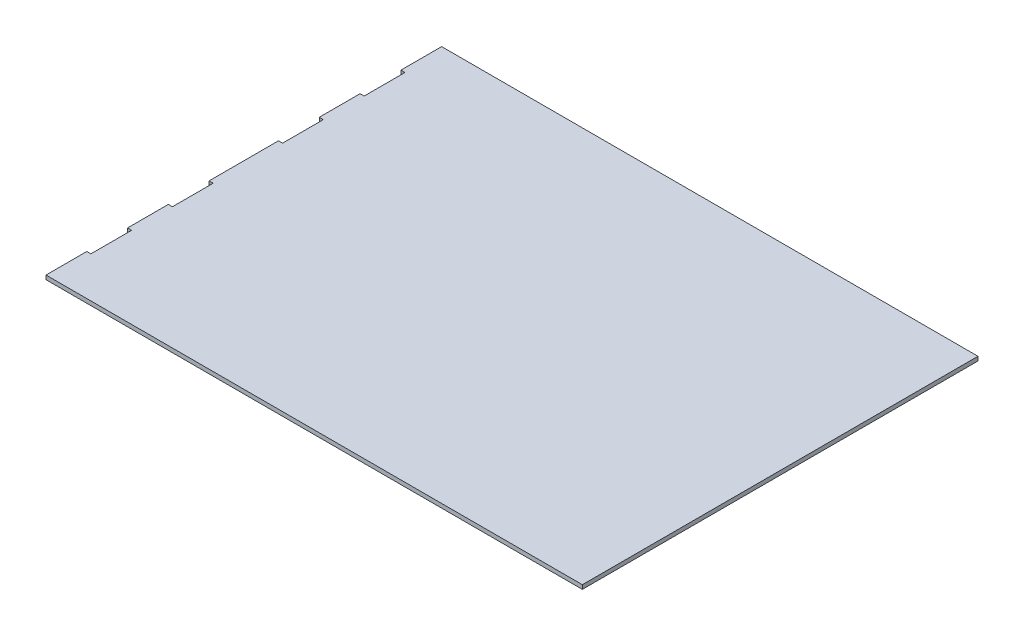
ISO-10303-21;
HEADER;
FILE_DESCRIPTION(('STEP AP214'),'2;1');
FILE_NAME('part.step','',(''),(''),'','','');
FILE_SCHEMA(('AUTOMOTIVE_DESIGN { 1 0 10303 214 1 1 1 1 }'));
ENDSEC;
DATA;
#1=APPLICATION_CONTEXT('core data for automotive mechanical design processes');
#2=APPLICATION_PROTOCOL_DEFINITION('international standard','automotive_design',2000,#1);
#3=PRODUCT_CONTEXT('',#1,'mechanical');
#4=PRODUCT('Part','Part','',(#3));
#5=PRODUCT_RELATED_PRODUCT_CATEGORY('part','',(#4));
#6=PRODUCT_DEFINITION_FORMATION('','',#4);
#7=PRODUCT_DEFINITION_CONTEXT('part definition',#1,'design');
#8=PRODUCT_DEFINITION('design','',#6,#7);
#9=PRODUCT_DEFINITION_SHAPE('','',#8);
#10=(LENGTH_UNIT() NAMED_UNIT(*) SI_UNIT(.MILLI.,.METRE.));
#11=(NAMED_UNIT(*) PLANE_ANGLE_UNIT() SI_UNIT($,.RADIAN.));
#12=(NAMED_UNIT(*) SI_UNIT($,.STERADIAN.) SOLID_ANGLE_UNIT());
#13=UNCERTAINTY_MEASURE_WITH_UNIT(LENGTH_MEASURE(1.E-05),#10,'distance_accuracy_value','');
#14=(GEOMETRIC_REPRESENTATION_CONTEXT(3) GLOBAL_UNCERTAINTY_ASSIGNED_CONTEXT((#13)) GLOBAL_UNIT_ASSIGNED_CONTEXT((#10,
#11,#12)) REPRESENTATION_CONTEXT('',''));
#15=CARTESIAN_POINT('',(0.,0.,0.));
#16=DIRECTION('',(0.,0.,1.));
#17=DIRECTION('',(1.,0.,0.));
#18=AXIS2_PLACEMENT_3D('',#15,#16,#17);
#19=CARTESIAN_POINT('',(-131.5,2.,-97.));
#20=DIRECTION('',(1.,0.,0.));
#21=DIRECTION('',(0.,0.,-1.));
#22=AXIS2_PLACEMENT_3D('',#19,#20,#21);
#23=PLANE('',#22);
#24=DIRECTION('',(0.,0.,1.));
#25=VECTOR('',#24,1.);
#26=CARTESIAN_POINT('',(-131.5,0.,-97.));
#27=LINE('',#26,#25);
#28=CARTESIAN_POINT('',(-131.5,0.,-97.));
#29=VERTEX_POINT('',#28);
#30=CARTESIAN_POINT('',(-131.5,0.,-77.));
#31=VERTEX_POINT('',#30);
#32=EDGE_CURVE('E213',#29,#31,#27,.T.);
#33=ORIENTED_EDGE('',*,*,#32,.T.);
#34=DIRECTION('',(0.,1.,0.));
#35=VECTOR('',#34,1.);
#36=CARTESIAN_POINT('',(-131.5,-8.,-77.));
#37=LINE('',#36,#35);
#38=CARTESIAN_POINT('',(-131.5,2.,-77.));
#39=VERTEX_POINT('',#38);
#40=EDGE_CURVE('E212',#31,#39,#37,.T.);
#41=ORIENTED_EDGE('',*,*,#40,.T.);
#42=DIRECTION('',(0.,0.,1.));
#43=VECTOR('',#42,1.);
#44=CARTESIAN_POINT('',(-131.5,2.,-97.));
#45=LINE('',#44,#43);
#46=CARTESIAN_POINT('',(-131.5,2.,-97.));
#47=VERTEX_POINT('',#46);
#48=EDGE_CURVE('E193',#47,#39,#45,.T.);
#49=ORIENTED_EDGE('',*,*,#48,.F.);
#50=DIRECTION('',(0.,-1.,0.));
#51=VECTOR('',#50,1.);
#52=CARTESIAN_POINT('',(-131.5,2.,-97.));
#53=LINE('',#52,#51);
#54=EDGE_CURVE('E231',#47,#29,#53,.T.);
#55=ORIENTED_EDGE('',*,*,#54,.T.);
#56=EDGE_LOOP('',(#33,#41,#49,#55));
#57=FACE_BOUND('',#56,.T.);
#58=ADVANCED_FACE('F33',(#57),#23,.F.);
#59=CARTESIAN_POINT('',(-131.5,2.,-57.));
#60=VERTEX_POINT('',#59);
#61=CARTESIAN_POINT('',(-131.5,2.,-37.));
#62=VERTEX_POINT('',#61);
#63=EDGE_CURVE('E186',#60,#62,#45,.T.);
#64=ORIENTED_EDGE('',*,*,#63,.F.);
#65=DIRECTION('',(0.,1.,0.));
#66=VECTOR('',#65,1.);
#67=CARTESIAN_POINT('',(-131.5,-8.,-57.));
#68=LINE('',#67,#66);
#69=CARTESIAN_POINT('',(-131.5,0.,-57.));
#70=VERTEX_POINT('',#69);
#71=EDGE_CURVE('E168',#70,#60,#68,.T.);
#72=ORIENTED_EDGE('',*,*,#71,.F.);
#73=CARTESIAN_POINT('',(-131.5,0.,-37.));
#74=VERTEX_POINT('',#73);
#75=EDGE_CURVE('E217',#70,#74,#27,.T.);
#76=ORIENTED_EDGE('',*,*,#75,.T.);
#77=DIRECTION('',(0.,1.,0.));
#78=VECTOR('',#77,1.);
#79=CARTESIAN_POINT('',(-131.5,-8.,-37.));
#80=LINE('',#79,#78);
#81=EDGE_CURVE('E189',#74,#62,#80,.T.);
#82=ORIENTED_EDGE('',*,*,#81,.T.);
#83=EDGE_LOOP('',(#64,#72,#76,#82));
#84=FACE_BOUND('',#83,.T.);
#85=ADVANCED_FACE('F192',(#84),#23,.F.);
#86=CARTESIAN_POINT('',(-131.5,2.,-17.));
#87=VERTEX_POINT('',#86);
#88=CARTESIAN_POINT('',(-131.5,2.,17.));
#89=VERTEX_POINT('',#88);
#90=EDGE_CURVE('E194',#87,#89,#45,.T.);
#91=ORIENTED_EDGE('',*,*,#90,.F.);
#92=DIRECTION('',(0.,1.,0.));
#93=VECTOR('',#92,1.);
#94=CARTESIAN_POINT('',(-131.5,-8.,-17.));
#95=LINE('',#94,#93);
#96=CARTESIAN_POINT('',(-131.5,0.,-17.));
#97=VERTEX_POINT('',#96);
#98=EDGE_CURVE('E284',#97,#87,#95,.T.);
#99=ORIENTED_EDGE('',*,*,#98,.F.);
#100=CARTESIAN_POINT('',(-131.5,0.,17.));
#101=VERTEX_POINT('',#100);
#102=EDGE_CURVE('E385',#97,#101,#27,.T.);
#103=ORIENTED_EDGE('',*,*,#102,.T.);
#104=DIRECTION('',(0.,1.,0.));
#105=VECTOR('',#104,1.);
#106=CARTESIAN_POINT('',(-131.5,-8.,17.));
#107=LINE('',#106,#105);
#108=EDGE_CURVE('E279',#101,#89,#107,.T.);
#109=ORIENTED_EDGE('',*,*,#108,.T.);
#110=EDGE_LOOP('',(#91,#99,#103,#109));
#111=FACE_BOUND('',#110,.T.);
#112=ADVANCED_FACE('F357',(#111),#23,.F.);
#113=CARTESIAN_POINT('',(-131.5,2.,37.));
#114=VERTEX_POINT('',#113);
#115=CARTESIAN_POINT('',(-131.5,2.,57.));
#116=VERTEX_POINT('',#115);
#117=EDGE_CURVE('E200',#114,#116,#45,.T.);
#118=ORIENTED_EDGE('',*,*,#117,.F.);
#119=DIRECTION('',(0.,1.,0.));
#120=VECTOR('',#119,1.);
#121=CARTESIAN_POINT('',(-131.5,-8.,37.));
#122=LINE('',#121,#120);
#123=CARTESIAN_POINT('',(-131.5,0.,37.));
#124=VERTEX_POINT('',#123);
#125=EDGE_CURVE('E299',#124,#114,#122,.T.);
#126=ORIENTED_EDGE('',*,*,#125,.F.);
#127=CARTESIAN_POINT('',(-131.5,0.,57.));
#128=VERTEX_POINT('',#127);
#129=EDGE_CURVE('E384',#124,#128,#27,.T.);
#130=ORIENTED_EDGE('',*,*,#129,.T.);
#131=DIRECTION('',(0.,1.,0.));
#132=VECTOR('',#131,1.);
#133=CARTESIAN_POINT('',(-131.5,-8.,57.));
#134=LINE('',#133,#132);
#135=EDGE_CURVE('E294',#128,#116,#134,.T.);
#136=ORIENTED_EDGE('',*,*,#135,.T.);
#137=EDGE_LOOP('',(#118,#126,#130,#136));
#138=FACE_BOUND('',#137,.T.);
#139=ADVANCED_FACE('F361',(#138),#23,.F.);
#140=CARTESIAN_POINT('',(-131.5,2.,-97.));
#141=DIRECTION('',(0.,0.,1.));
#142=DIRECTION('',(1.,0.,0.));
#143=AXIS2_PLACEMENT_3D('',#140,#141,#142);
#144=PLANE('',#143);
#145=DIRECTION('',(-1.,0.,0.));
#146=VECTOR('',#145,1.);
#147=CARTESIAN_POINT('',(-131.5,0.,-97.));
#148=LINE('',#147,#146);
#149=CARTESIAN_POINT('',(131.5,0.,-97.));
#150=VERTEX_POINT('',#149);
#151=EDGE_CURVE('E209',#150,#29,#148,.T.);
#152=ORIENTED_EDGE('',*,*,#151,.T.);
#153=ORIENTED_EDGE('',*,*,#54,.F.);
#154=DIRECTION('',(-1.,0.,0.));
#155=VECTOR('',#154,1.);
#156=CARTESIAN_POINT('',(113.5,2.,-97.));
#157=LINE('',#156,#155);
#158=CARTESIAN_POINT('',(131.5,2.,-97.));
#159=VERTEX_POINT('',#158);
#160=EDGE_CURVE('E203',#159,#47,#157,.T.);
#161=ORIENTED_EDGE('',*,*,#160,.F.);
#162=DIRECTION('',(0.,-1.,0.));
#163=VECTOR('',#162,1.);
#164=CARTESIAN_POINT('',(131.5,2.,-97.));
#165=LINE('',#164,#163);
#166=EDGE_CURVE('E208',#159,#150,#165,.T.);
#167=ORIENTED_EDGE('',*,*,#166,.T.);
#168=EDGE_LOOP('',(#152,#153,#161,#167));
#169=FACE_BOUND('',#168,.T.);
#170=ADVANCED_FACE('F35',(#169),#144,.F.);
#171=CARTESIAN_POINT('',(-131.5,2.,77.));
#172=VERTEX_POINT('',#171);
#173=CARTESIAN_POINT('',(-131.5,2.,97.));
#174=VERTEX_POINT('',#173);
#175=EDGE_CURVE('E198',#172,#174,#45,.T.);
#176=ORIENTED_EDGE('',*,*,#175,.F.);
#177=DIRECTION('',(0.,1.,0.));
#178=VECTOR('',#177,1.);
#179=CARTESIAN_POINT('',(-131.5,-8.,77.));
#180=LINE('',#179,#178);
#181=CARTESIAN_POINT('',(-131.5,0.,77.));
#182=VERTEX_POINT('',#181);
#183=EDGE_CURVE('E315',#182,#172,#180,.T.);
#184=ORIENTED_EDGE('',*,*,#183,.F.);
#185=CARTESIAN_POINT('',(-131.5,0.,97.));
#186=VERTEX_POINT('',#185);
#187=EDGE_CURVE('E211',#182,#186,#27,.T.);
#188=ORIENTED_EDGE('',*,*,#187,.T.);
#189=DIRECTION('',(0.,-1.,0.));
#190=VECTOR('',#189,1.);
#191=CARTESIAN_POINT('',(-131.5,2.,97.));
#192=LINE('',#191,#190);
#193=EDGE_CURVE('E228',#174,#186,#192,.T.);
#194=ORIENTED_EDGE('',*,*,#193,.F.);
#195=EDGE_LOOP('',(#176,#184,#188,#194));
#196=FACE_BOUND('',#195,.T.);
#197=ADVANCED_FACE('F331',(#196),#23,.F.);
#198=CARTESIAN_POINT('',(131.5,2.,97.));
#199=DIRECTION('',(0.,0.,-1.));
#200=DIRECTION('',(-1.,0.,0.));
#201=AXIS2_PLACEMENT_3D('',#198,#199,#200);
#202=PLANE('',#201);
#203=DIRECTION('',(1.,0.,0.));
#204=VECTOR('',#203,1.);
#205=CARTESIAN_POINT('',(131.5,0.,97.));
#206=LINE('',#205,#204);
#207=CARTESIAN_POINT('',(131.5,0.,97.));
#208=VERTEX_POINT('',#207);
#209=EDGE_CURVE('E216',#186,#208,#206,.T.);
#210=ORIENTED_EDGE('',*,*,#209,.T.);
#211=DIRECTION('',(0.,-1.,0.));
#212=VECTOR('',#211,1.);
#213=CARTESIAN_POINT('',(131.5,2.,97.));
#214=LINE('',#213,#212);
#215=CARTESIAN_POINT('',(131.5,2.,97.));
#216=VERTEX_POINT('',#215);
#217=EDGE_CURVE('E225',#216,#208,#214,.T.);
#218=ORIENTED_EDGE('',*,*,#217,.F.);
#219=DIRECTION('',(1.,0.,0.));
#220=VECTOR('',#219,1.);
#221=CARTESIAN_POINT('',(-113.5,2.,97.));
#222=LINE('',#221,#220);
#223=EDGE_CURVE('E197',#174,#216,#222,.T.);
#224=ORIENTED_EDGE('',*,*,#223,.F.);
#225=ORIENTED_EDGE('',*,*,#193,.T.);
#226=EDGE_LOOP('',(#210,#218,#224,#225));
#227=FACE_BOUND('',#226,.T.);
#228=ADVANCED_FACE('F360',(#227),#202,.F.);
#229=CARTESIAN_POINT('',(131.5,2.,-77.));
#230=DIRECTION('',(-1.,0.,0.));
#231=DIRECTION('',(0.,0.,1.));
#232=AXIS2_PLACEMENT_3D('',#229,#230,#231);
#233=PLANE('',#232);
#234=DIRECTION('',(0.,0.,-1.));
#235=VECTOR('',#234,1.);
#236=CARTESIAN_POINT('',(131.5,0.,-77.));
#237=LINE('',#236,#235);
#238=EDGE_CURVE('E220',#208,#150,#237,.T.);
#239=ORIENTED_EDGE('',*,*,#238,.T.);
#240=ORIENTED_EDGE('',*,*,#166,.F.);
#241=DIRECTION('',(0.,0.,-1.));
#242=VECTOR('',#241,1.);
#243=CARTESIAN_POINT('',(131.5,2.,97.));
#244=LINE('',#243,#242);
#245=EDGE_CURVE('E206',#216,#159,#244,.T.);
#246=ORIENTED_EDGE('',*,*,#245,.F.);
#247=ORIENTED_EDGE('',*,*,#217,.T.);
#248=EDGE_LOOP('',(#239,#240,#246,#247));
#249=FACE_BOUND('',#248,.T.);
#250=ADVANCED_FACE('F366',(#249),#233,.F.);
#251=CARTESIAN_POINT('',(0.,2.,0.));
#252=DIRECTION('',(0.,1.,0.));
#253=DIRECTION('',(0.,0.,1.));
#254=AXIS2_PLACEMENT_3D('',#251,#252,#253);
#255=PLANE('',#254);
#256=DIRECTION('',(-1.,0.,0.));
#257=VECTOR('',#256,1.);
#258=CARTESIAN_POINT('',(-131.5,2.,-77.));
#259=LINE('',#258,#257);
#260=CARTESIAN_POINT('',(-129.5,2.,-77.));
#261=VERTEX_POINT('',#260);
#262=EDGE_CURVE('E179',#261,#39,#259,.T.);
#263=ORIENTED_EDGE('',*,*,#262,.F.);
#264=DIRECTION('',(0.,0.,-1.));
#265=VECTOR('',#264,1.);
#266=CARTESIAN_POINT('',(-129.5,2.,-77.));
#267=LINE('',#266,#265);
#268=CARTESIAN_POINT('',(-129.5,2.,-57.));
#269=VERTEX_POINT('',#268);
#270=EDGE_CURVE('E188',#269,#261,#267,.T.);
#271=ORIENTED_EDGE('',*,*,#270,.F.);
#272=DIRECTION('',(1.,0.,0.));
#273=VECTOR('',#272,1.);
#274=CARTESIAN_POINT('',(-131.5,2.,-57.));
#275=LINE('',#274,#273);
#276=EDGE_CURVE('E171',#60,#269,#275,.T.);
#277=ORIENTED_EDGE('',*,*,#276,.F.);
#278=ORIENTED_EDGE('',*,*,#63,.T.);
#279=DIRECTION('',(-1.,0.,0.));
#280=VECTOR('',#279,1.);
#281=CARTESIAN_POINT('',(-131.5,2.,-37.));
#282=LINE('',#281,#280);
#283=CARTESIAN_POINT('',(-129.5,2.,-37.));
#284=VERTEX_POINT('',#283);
#285=EDGE_CURVE('E282',#284,#62,#282,.T.);
#286=ORIENTED_EDGE('',*,*,#285,.F.);
#287=DIRECTION('',(0.,0.,-1.));
#288=VECTOR('',#287,1.);
#289=CARTESIAN_POINT('',(-129.5,2.,-37.));
#290=LINE('',#289,#288);
#291=CARTESIAN_POINT('',(-129.5,2.,-17.));
#292=VERTEX_POINT('',#291);
#293=EDGE_CURVE('E278',#292,#284,#290,.T.);
#294=ORIENTED_EDGE('',*,*,#293,.F.);
#295=DIRECTION('',(1.,0.,0.));
#296=VECTOR('',#295,1.);
#297=CARTESIAN_POINT('',(-131.5,2.,-17.));
#298=LINE('',#297,#296);
#299=EDGE_CURVE('E276',#87,#292,#298,.T.);
#300=ORIENTED_EDGE('',*,*,#299,.F.);
#301=ORIENTED_EDGE('',*,*,#90,.T.);
#302=DIRECTION('',(-1.,0.,0.));
#303=VECTOR('',#302,1.);
#304=CARTESIAN_POINT('',(-131.5,2.,17.));
#305=LINE('',#304,#303);
#306=CARTESIAN_POINT('',(-129.5,2.,17.));
#307=VERTEX_POINT('',#306);
#308=EDGE_CURVE('E297',#307,#89,#305,.T.);
#309=ORIENTED_EDGE('',*,*,#308,.F.);
#310=DIRECTION('',(0.,0.,-1.));
#311=VECTOR('',#310,1.);
#312=CARTESIAN_POINT('',(-129.5,2.,37.));
#313=LINE('',#312,#311);
#314=CARTESIAN_POINT('',(-129.5,2.,37.));
#315=VERTEX_POINT('',#314);
#316=EDGE_CURVE('E293',#315,#307,#313,.T.);
#317=ORIENTED_EDGE('',*,*,#316,.F.);
#318=DIRECTION('',(1.,0.,0.));
#319=VECTOR('',#318,1.);
#320=CARTESIAN_POINT('',(-131.5,2.,37.));
#321=LINE('',#320,#319);
#322=EDGE_CURVE('E290',#114,#315,#321,.T.);
#323=ORIENTED_EDGE('',*,*,#322,.F.);
#324=ORIENTED_EDGE('',*,*,#117,.T.);
#325=DIRECTION('',(-1.,0.,0.));
#326=VECTOR('',#325,1.);
#327=CARTESIAN_POINT('',(-131.5,2.,57.));
#328=LINE('',#327,#326);
#329=CARTESIAN_POINT('',(-129.5,2.,57.));
#330=VERTEX_POINT('',#329);
#331=EDGE_CURVE('E313',#330,#116,#328,.T.);
#332=ORIENTED_EDGE('',*,*,#331,.F.);
#333=DIRECTION('',(0.,0.,-1.));
#334=VECTOR('',#333,1.);
#335=CARTESIAN_POINT('',(-129.5,2.,77.));
#336=LINE('',#335,#334);
#337=CARTESIAN_POINT('',(-129.5,2.,77.));
#338=VERTEX_POINT('',#337);
#339=EDGE_CURVE('E310',#338,#330,#336,.T.);
#340=ORIENTED_EDGE('',*,*,#339,.F.);
#341=DIRECTION('',(1.,0.,0.));
#342=VECTOR('',#341,1.);
#343=CARTESIAN_POINT('',(-131.5,2.,77.));
#344=LINE('',#343,#342);
#345=EDGE_CURVE('E307',#172,#338,#344,.T.);
#346=ORIENTED_EDGE('',*,*,#345,.F.);
#347=ORIENTED_EDGE('',*,*,#175,.T.);
#348=ORIENTED_EDGE('',*,*,#223,.T.);
#349=ORIENTED_EDGE('',*,*,#245,.T.);
#350=ORIENTED_EDGE('',*,*,#160,.T.);
#351=ORIENTED_EDGE('',*,*,#48,.T.);
#352=EDGE_LOOP('',(#263,#271,#277,#278,#286,#294,#300,#301,#309,#317,#323,#324,#332,#340,#346,
#347,#348,#349,#350,#351));
#353=FACE_BOUND('',#352,.T.);
#354=ADVANCED_FACE('F184',(#353),#255,.T.);
#355=CARTESIAN_POINT('',(0.,0.,0.));
#356=DIRECTION('',(0.,1.,0.));
#357=DIRECTION('',(0.,0.,1.));
#358=AXIS2_PLACEMENT_3D('',#355,#356,#357);
#359=PLANE('',#358);
#360=DIRECTION('',(0.,0.,-1.));
#361=VECTOR('',#360,1.);
#362=CARTESIAN_POINT('',(-129.5,0.,0.));
#363=LINE('',#362,#361);
#364=CARTESIAN_POINT('',(-129.5,0.,-57.));
#365=VERTEX_POINT('',#364);
#366=CARTESIAN_POINT('',(-129.5,0.,-77.));
#367=VERTEX_POINT('',#366);
#368=EDGE_CURVE('E41',#365,#367,#363,.T.);
#369=ORIENTED_EDGE('',*,*,#368,.T.);
#370=DIRECTION('',(-1.,0.,0.));
#371=VECTOR('',#370,1.);
#372=CARTESIAN_POINT('',(0.,0.,-77.));
#373=LINE('',#372,#371);
#374=EDGE_CURVE('E11',#367,#31,#373,.T.);
#375=ORIENTED_EDGE('',*,*,#374,.T.);
#376=ORIENTED_EDGE('',*,*,#32,.F.);
#377=ORIENTED_EDGE('',*,*,#151,.F.);
#378=ORIENTED_EDGE('',*,*,#238,.F.);
#379=ORIENTED_EDGE('',*,*,#209,.F.);
#380=ORIENTED_EDGE('',*,*,#187,.F.);
#381=DIRECTION('',(1.,0.,0.));
#382=VECTOR('',#381,1.);
#383=CARTESIAN_POINT('',(0.,0.,77.));
#384=LINE('',#383,#382);
#385=CARTESIAN_POINT('',(-129.5,0.,77.));
#386=VERTEX_POINT('',#385);
#387=EDGE_CURVE('E234',#182,#386,#384,.T.);
#388=ORIENTED_EDGE('',*,*,#387,.T.);
#389=DIRECTION('',(0.,0.,-1.));
#390=VECTOR('',#389,1.);
#391=CARTESIAN_POINT('',(-129.5,0.,0.));
#392=LINE('',#391,#390);
#393=CARTESIAN_POINT('',(-129.5,0.,57.));
#394=VERTEX_POINT('',#393);
#395=EDGE_CURVE('E237',#386,#394,#392,.T.);
#396=ORIENTED_EDGE('',*,*,#395,.T.);
#397=DIRECTION('',(-1.,0.,0.));
#398=VECTOR('',#397,1.);
#399=CARTESIAN_POINT('',(0.,0.,57.));
#400=LINE('',#399,#398);
#401=EDGE_CURVE('E240',#394,#128,#400,.T.);
#402=ORIENTED_EDGE('',*,*,#401,.T.);
#403=ORIENTED_EDGE('',*,*,#129,.F.);
#404=DIRECTION('',(1.,0.,0.));
#405=VECTOR('',#404,1.);
#406=CARTESIAN_POINT('',(0.,0.,37.));
#407=LINE('',#406,#405);
#408=CARTESIAN_POINT('',(-129.5,0.,37.));
#409=VERTEX_POINT('',#408);
#410=EDGE_CURVE('E243',#124,#409,#407,.T.);
#411=ORIENTED_EDGE('',*,*,#410,.T.);
#412=DIRECTION('',(0.,0.,-1.));
#413=VECTOR('',#412,1.);
#414=CARTESIAN_POINT('',(-129.5,0.,0.));
#415=LINE('',#414,#413);
#416=CARTESIAN_POINT('',(-129.5,0.,17.));
#417=VERTEX_POINT('',#416);
#418=EDGE_CURVE('E246',#409,#417,#415,.T.);
#419=ORIENTED_EDGE('',*,*,#418,.T.);
#420=DIRECTION('',(-1.,0.,0.));
#421=VECTOR('',#420,1.);
#422=CARTESIAN_POINT('',(0.,0.,17.));
#423=LINE('',#422,#421);
#424=EDGE_CURVE('E249',#417,#101,#423,.T.);
#425=ORIENTED_EDGE('',*,*,#424,.T.);
#426=ORIENTED_EDGE('',*,*,#102,.F.);
#427=DIRECTION('',(1.,0.,0.));
#428=VECTOR('',#427,1.);
#429=CARTESIAN_POINT('',(0.,0.,-17.));
#430=LINE('',#429,#428);
#431=CARTESIAN_POINT('',(-129.5,0.,-17.));
#432=VERTEX_POINT('',#431);
#433=EDGE_CURVE('E252',#97,#432,#430,.T.);
#434=ORIENTED_EDGE('',*,*,#433,.T.);
#435=DIRECTION('',(0.,0.,-1.));
#436=VECTOR('',#435,1.);
#437=CARTESIAN_POINT('',(-129.5,0.,0.));
#438=LINE('',#437,#436);
#439=CARTESIAN_POINT('',(-129.5,0.,-37.));
#440=VERTEX_POINT('',#439);
#441=EDGE_CURVE('E255',#432,#440,#438,.T.);
#442=ORIENTED_EDGE('',*,*,#441,.T.);
#443=DIRECTION('',(-1.,0.,0.));
#444=VECTOR('',#443,1.);
#445=CARTESIAN_POINT('',(0.,0.,-37.));
#446=LINE('',#445,#444);
#447=EDGE_CURVE('E258',#440,#74,#446,.T.);
#448=ORIENTED_EDGE('',*,*,#447,.T.);
#449=ORIENTED_EDGE('',*,*,#75,.F.);
#450=DIRECTION('',(1.,0.,0.));
#451=VECTOR('',#450,1.);
#452=CARTESIAN_POINT('',(0.,0.,-57.));
#453=LINE('',#452,#451);
#454=EDGE_CURVE('E174',#70,#365,#453,.T.);
#455=ORIENTED_EDGE('',*,*,#454,.T.);
#456=EDGE_LOOP('',(#369,#375,#376,#377,#378,#379,#380,#388,#396,#402,#403,#411,#419,#425,#426,
#434,#442,#448,#449,#455));
#457=FACE_BOUND('',#456,.T.);
#458=ADVANCED_FACE('F263',(#457),#359,.F.);
#459=CARTESIAN_POINT('',(-131.5,-8.,57.));
#460=DIRECTION('',(0.,0.,-1.));
#461=DIRECTION('',(-1.,0.,0.));
#462=AXIS2_PLACEMENT_3D('',#459,#460,#461);
#463=PLANE('',#462);
#464=DIRECTION('',(0.,1.,0.));
#465=VECTOR('',#464,1.);
#466=CARTESIAN_POINT('',(-129.5,-8.,57.));
#467=LINE('',#466,#465);
#468=EDGE_CURVE('E318',#394,#330,#467,.T.);
#469=ORIENTED_EDGE('',*,*,#468,.T.);
#470=ORIENTED_EDGE('',*,*,#331,.T.);
#471=ORIENTED_EDGE('',*,*,#135,.F.);
#472=ORIENTED_EDGE('',*,*,#401,.F.);
#473=EDGE_LOOP('',(#469,#470,#471,#472));
#474=FACE_BOUND('',#473,.T.);
#475=ADVANCED_FACE('F398',(#474),#463,.F.);
#476=CARTESIAN_POINT('',(-129.5,-8.,77.));
#477=DIRECTION('',(1.,0.,0.));
#478=DIRECTION('',(0.,0.,-1.));
#479=AXIS2_PLACEMENT_3D('',#476,#477,#478);
#480=PLANE('',#479);
#481=DIRECTION('',(0.,1.,0.));
#482=VECTOR('',#481,1.);
#483=CARTESIAN_POINT('',(-129.5,-8.,77.));
#484=LINE('',#483,#482);
#485=EDGE_CURVE('E320',#386,#338,#484,.T.);
#486=ORIENTED_EDGE('',*,*,#485,.T.);
#487=ORIENTED_EDGE('',*,*,#339,.T.);
#488=ORIENTED_EDGE('',*,*,#468,.F.);
#489=ORIENTED_EDGE('',*,*,#395,.F.);
#490=EDGE_LOOP('',(#486,#487,#488,#489));
#491=FACE_BOUND('',#490,.T.);
#492=ADVANCED_FACE('F403',(#491),#480,.F.);
#493=CARTESIAN_POINT('',(-131.5,-8.,77.));
#494=DIRECTION('',(0.,0.,1.));
#495=DIRECTION('',(1.,0.,0.));
#496=AXIS2_PLACEMENT_3D('',#493,#494,#495);
#497=PLANE('',#496);
#498=ORIENTED_EDGE('',*,*,#183,.T.);
#499=ORIENTED_EDGE('',*,*,#345,.T.);
#500=ORIENTED_EDGE('',*,*,#485,.F.);
#501=ORIENTED_EDGE('',*,*,#387,.F.);
#502=EDGE_LOOP('',(#498,#499,#500,#501));
#503=FACE_BOUND('',#502,.T.);
#504=ADVANCED_FACE('F324',(#503),#497,.F.);
#505=CARTESIAN_POINT('',(-131.5,-8.,17.));
#506=DIRECTION('',(0.,0.,-1.));
#507=DIRECTION('',(-1.,0.,0.));
#508=AXIS2_PLACEMENT_3D('',#505,#506,#507);
#509=PLANE('',#508);
#510=DIRECTION('',(0.,1.,0.));
#511=VECTOR('',#510,1.);
#512=CARTESIAN_POINT('',(-129.5,-8.,17.));
#513=LINE('',#512,#511);
#514=EDGE_CURVE('E302',#417,#307,#513,.T.);
#515=ORIENTED_EDGE('',*,*,#514,.T.);
#516=ORIENTED_EDGE('',*,*,#308,.T.);
#517=ORIENTED_EDGE('',*,*,#108,.F.);
#518=ORIENTED_EDGE('',*,*,#424,.F.);
#519=EDGE_LOOP('',(#515,#516,#517,#518));
#520=FACE_BOUND('',#519,.T.);
#521=ADVANCED_FACE('F402',(#520),#509,.F.);
#522=CARTESIAN_POINT('',(-129.5,-8.,37.));
#523=DIRECTION('',(1.,0.,0.));
#524=DIRECTION('',(0.,0.,-1.));
#525=AXIS2_PLACEMENT_3D('',#522,#523,#524);
#526=PLANE('',#525);
#527=DIRECTION('',(0.,1.,0.));
#528=VECTOR('',#527,1.);
#529=CARTESIAN_POINT('',(-129.5,-8.,37.));
#530=LINE('',#529,#528);
#531=EDGE_CURVE('E304',#409,#315,#530,.T.);
#532=ORIENTED_EDGE('',*,*,#531,.T.);
#533=ORIENTED_EDGE('',*,*,#316,.T.);
#534=ORIENTED_EDGE('',*,*,#514,.F.);
#535=ORIENTED_EDGE('',*,*,#418,.F.);
#536=EDGE_LOOP('',(#532,#533,#534,#535));
#537=FACE_BOUND('',#536,.T.);
#538=ADVANCED_FACE('F413',(#537),#526,.F.);
#539=CARTESIAN_POINT('',(-131.5,-8.,37.));
#540=DIRECTION('',(0.,0.,1.));
#541=DIRECTION('',(1.,0.,0.));
#542=AXIS2_PLACEMENT_3D('',#539,#540,#541);
#543=PLANE('',#542);
#544=ORIENTED_EDGE('',*,*,#125,.T.);
#545=ORIENTED_EDGE('',*,*,#322,.T.);
#546=ORIENTED_EDGE('',*,*,#531,.F.);
#547=ORIENTED_EDGE('',*,*,#410,.F.);
#548=EDGE_LOOP('',(#544,#545,#546,#547));
#549=FACE_BOUND('',#548,.T.);
#550=ADVANCED_FACE('F382',(#549),#543,.F.);
#551=CARTESIAN_POINT('',(-131.5,-8.,-37.));
#552=DIRECTION('',(0.,0.,-1.));
#553=DIRECTION('',(-1.,0.,0.));
#554=AXIS2_PLACEMENT_3D('',#551,#552,#553);
#555=PLANE('',#554);
#556=DIRECTION('',(0.,1.,0.));
#557=VECTOR('',#556,1.);
#558=CARTESIAN_POINT('',(-129.5,-8.,-37.));
#559=LINE('',#558,#557);
#560=EDGE_CURVE('E286',#440,#284,#559,.T.);
#561=ORIENTED_EDGE('',*,*,#560,.T.);
#562=ORIENTED_EDGE('',*,*,#285,.T.);
#563=ORIENTED_EDGE('',*,*,#81,.F.);
#564=ORIENTED_EDGE('',*,*,#447,.F.);
#565=EDGE_LOOP('',(#561,#562,#563,#564));
#566=FACE_BOUND('',#565,.T.);
#567=ADVANCED_FACE('F412',(#566),#555,.F.);
#568=CARTESIAN_POINT('',(-129.5,-8.,-37.));
#569=DIRECTION('',(1.,0.,0.));
#570=DIRECTION('',(0.,0.,-1.));
#571=AXIS2_PLACEMENT_3D('',#568,#569,#570);
#572=PLANE('',#571);
#573=DIRECTION('',(0.,1.,0.));
#574=VECTOR('',#573,1.);
#575=CARTESIAN_POINT('',(-129.5,-8.,-17.));
#576=LINE('',#575,#574);
#577=EDGE_CURVE('E56',#432,#292,#576,.T.);
#578=ORIENTED_EDGE('',*,*,#577,.T.);
#579=ORIENTED_EDGE('',*,*,#293,.T.);
#580=ORIENTED_EDGE('',*,*,#560,.F.);
#581=ORIENTED_EDGE('',*,*,#441,.F.);
#582=EDGE_LOOP('',(#578,#579,#580,#581));
#583=FACE_BOUND('',#582,.T.);
#584=ADVANCED_FACE('F351',(#583),#572,.F.);
#585=CARTESIAN_POINT('',(-131.5,-8.,-17.));
#586=DIRECTION('',(0.,0.,1.));
#587=DIRECTION('',(1.,0.,0.));
#588=AXIS2_PLACEMENT_3D('',#585,#586,#587);
#589=PLANE('',#588);
#590=ORIENTED_EDGE('',*,*,#98,.T.);
#591=ORIENTED_EDGE('',*,*,#299,.T.);
#592=ORIENTED_EDGE('',*,*,#577,.F.);
#593=ORIENTED_EDGE('',*,*,#433,.F.);
#594=EDGE_LOOP('',(#590,#591,#592,#593));
#595=FACE_BOUND('',#594,.T.);
#596=ADVANCED_FACE('F344',(#595),#589,.F.);
#597=CARTESIAN_POINT('',(-131.5,-8.,-77.));
#598=DIRECTION('',(0.,0.,-1.));
#599=DIRECTION('',(-1.,0.,0.));
#600=AXIS2_PLACEMENT_3D('',#597,#598,#599);
#601=PLANE('',#600);
#602=DIRECTION('',(0.,1.,0.));
#603=VECTOR('',#602,1.);
#604=CARTESIAN_POINT('',(-129.5,-8.,-77.));
#605=LINE('',#604,#603);
#606=EDGE_CURVE('E268',#367,#261,#605,.T.);
#607=ORIENTED_EDGE('',*,*,#606,.T.);
#608=ORIENTED_EDGE('',*,*,#262,.T.);
#609=ORIENTED_EDGE('',*,*,#40,.F.);
#610=ORIENTED_EDGE('',*,*,#374,.F.);
#611=EDGE_LOOP('',(#607,#608,#609,#610));
#612=FACE_BOUND('',#611,.T.);
#613=ADVANCED_FACE('F341',(#612),#601,.F.);
#614=CARTESIAN_POINT('',(-129.5,-8.,-77.));
#615=DIRECTION('',(1.,0.,0.));
#616=DIRECTION('',(0.,0.,-1.));
#617=AXIS2_PLACEMENT_3D('',#614,#615,#616);
#618=PLANE('',#617);
#619=DIRECTION('',(0.,1.,0.));
#620=VECTOR('',#619,1.);
#621=CARTESIAN_POINT('',(-129.5,-8.,-57.));
#622=LINE('',#621,#620);
#623=EDGE_CURVE('E48',#365,#269,#622,.T.);
#624=ORIENTED_EDGE('',*,*,#623,.T.);
#625=ORIENTED_EDGE('',*,*,#270,.T.);
#626=ORIENTED_EDGE('',*,*,#606,.F.);
#627=ORIENTED_EDGE('',*,*,#368,.F.);
#628=EDGE_LOOP('',(#624,#625,#626,#627));
#629=FACE_BOUND('',#628,.T.);
#630=ADVANCED_FACE('F267',(#629),#618,.F.);
#631=CARTESIAN_POINT('',(-131.5,-8.,-57.));
#632=DIRECTION('',(0.,0.,1.));
#633=DIRECTION('',(1.,0.,0.));
#634=AXIS2_PLACEMENT_3D('',#631,#632,#633);
#635=PLANE('',#634);
#636=ORIENTED_EDGE('',*,*,#71,.T.);
#637=ORIENTED_EDGE('',*,*,#276,.T.);
#638=ORIENTED_EDGE('',*,*,#623,.F.);
#639=ORIENTED_EDGE('',*,*,#454,.F.);
#640=EDGE_LOOP('',(#636,#637,#638,#639));
#641=FACE_BOUND('',#640,.T.);
#642=ADVANCED_FACE('F170',(#641),#635,.F.);
#643=CLOSED_SHELL('',(#58,#85,#112,#139,#170,#197,#228,#250,#354,#458,#475,#492,#504,#521,#538,
#550,#567,#584,#596,#613,#630,#642));
#644=MANIFOLD_SOLID_BREP('B2',#643);
#645=ADVANCED_BREP_SHAPE_REPRESENTATION('',(#18,#644),#14);
#646=SHAPE_DEFINITION_REPRESENTATION(#9,#645);
ENDSEC;
END-ISO-10303-21;
